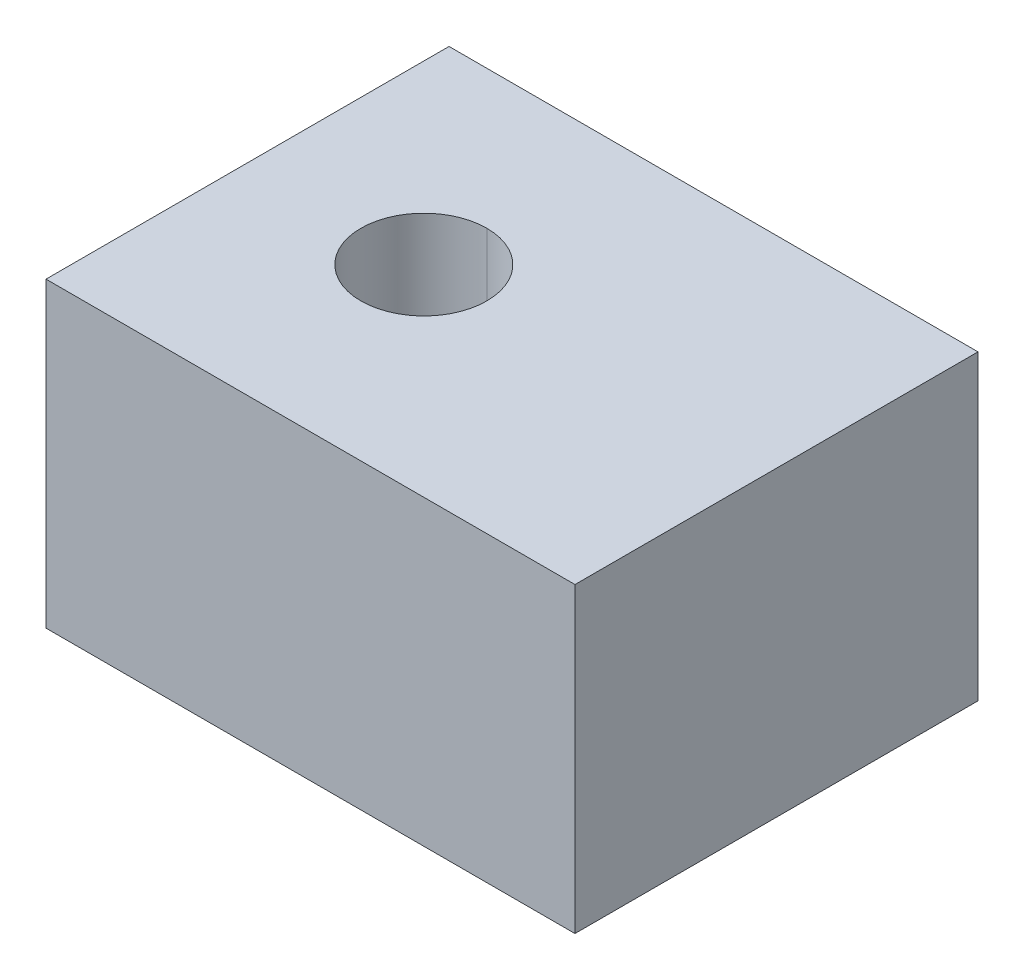
ISO-10303-21;
HEADER;
FILE_DESCRIPTION(('STEP AP214'),'2;1');
FILE_NAME('part.step','',(''),(''),'','','');
FILE_SCHEMA(('AUTOMOTIVE_DESIGN { 1 0 10303 214 1 1 1 1 }'));
ENDSEC;
DATA;
#1=APPLICATION_CONTEXT('core data for automotive mechanical design processes');
#2=APPLICATION_PROTOCOL_DEFINITION('international standard','automotive_design',2000,#1);
#3=PRODUCT_CONTEXT('',#1,'mechanical');
#4=PRODUCT('Part','Part','',(#3));
#5=PRODUCT_RELATED_PRODUCT_CATEGORY('part','',(#4));
#6=PRODUCT_DEFINITION_FORMATION('','',#4);
#7=PRODUCT_DEFINITION_CONTEXT('part definition',#1,'design');
#8=PRODUCT_DEFINITION('design','',#6,#7);
#9=PRODUCT_DEFINITION_SHAPE('','',#8);
#10=(LENGTH_UNIT() NAMED_UNIT(*) SI_UNIT(.MILLI.,.METRE.));
#11=(NAMED_UNIT(*) PLANE_ANGLE_UNIT() SI_UNIT($,.RADIAN.));
#12=(NAMED_UNIT(*) SI_UNIT($,.STERADIAN.) SOLID_ANGLE_UNIT());
#13=UNCERTAINTY_MEASURE_WITH_UNIT(LENGTH_MEASURE(1.E-05),#10,'distance_accuracy_value','');
#14=(GEOMETRIC_REPRESENTATION_CONTEXT(3) GLOBAL_UNCERTAINTY_ASSIGNED_CONTEXT((#13)) GLOBAL_UNIT_ASSIGNED_CONTEXT((#10,
#11,#12)) REPRESENTATION_CONTEXT('',''));
#15=CARTESIAN_POINT('',(0.,0.,0.));
#16=DIRECTION('',(0.,0.,1.));
#17=DIRECTION('',(1.,0.,0.));
#18=AXIS2_PLACEMENT_3D('',#15,#16,#17);
#19=CARTESIAN_POINT('',(7.,-4.99999999982492,0.));
#20=DIRECTION('',(0.,-1.,0.));
#21=DIRECTION('',(1.,0.,0.));
#22=AXIS2_PLACEMENT_3D('',#19,#20,#21);
#23=CONICAL_SURFACE('',#22,0.399999999790904,0.785398163255335);
#24=CARTESIAN_POINT('',(7.,-4.80000000000001,0.));
#25=DIRECTION('',(0.,-1.,0.));
#26=DIRECTION('',(1.,0.,0.));
#27=AXIS2_PLACEMENT_3D('',#24,#25,#26);
#28=CIRCLE('',#27,0.2);
#29=CARTESIAN_POINT('',(6.80000000004223,-4.79999999996879,0.));
#30=VERTEX_POINT('',#29);
#31=CARTESIAN_POINT('',(7.1999999999887,-4.799999999983,0.));
#32=VERTEX_POINT('',#31);
#33=EDGE_CURVE('E107',#30,#32,#28,.F.);
#34=ORIENTED_EDGE('',*,*,#33,.T.);
#35=DIRECTION('',(-0.707106781186555,0.70710678118654,0.));
#36=VECTOR('',#35,1.);
#37=CARTESIAN_POINT('',(499000.,-498997.599999989,0.));
#38=LINE('',#37,#36);
#39=CARTESIAN_POINT('',(7.39999999993052,-4.99999999993861,0.));
#40=VERTEX_POINT('',#39);
#41=EDGE_CURVE('E105',#32,#40,#38,.F.);
#42=ORIENTED_EDGE('',*,*,#41,.T.);
#43=CARTESIAN_POINT('',(7.,-4.99999999993861,0.));
#44=DIRECTION('',(0.,-1.,0.));
#45=DIRECTION('',(1.,0.,0.));
#46=AXIS2_PLACEMENT_3D('',#43,#44,#45);
#47=CIRCLE('',#46,0.399999999904591);
#48=CARTESIAN_POINT('',(6.60000000009791,-4.99999999991019,0.));
#49=VERTEX_POINT('',#48);
#50=EDGE_CURVE('E20',#49,#40,#47,.F.);
#51=ORIENTED_EDGE('',*,*,#50,.F.);
#52=DIRECTION('',(0.707106781186549,0.707106781186546,0.));
#53=VECTOR('',#52,1.);
#54=CARTESIAN_POINT('',(-498985.999999996,-498997.599999994,6.11090180246933E-11));
#55=LINE('',#54,#53);
#56=EDGE_CURVE('E119',#49,#30,#55,.T.);
#57=ORIENTED_EDGE('',*,*,#56,.T.);
#58=EDGE_LOOP('',(#34,#42,#51,#57));
#59=FACE_BOUND('',#58,.T.);
#60=ADVANCED_FACE('F17',(#59),#23,.F.);
#61=CARTESIAN_POINT('',(6.25,-5.,0.));
#62=DIRECTION('',(0.,-1.,0.));
#63=DIRECTION('',(1.,0.,0.));
#64=AXIS2_PLACEMENT_3D('',#61,#62,#63);
#65=PLANE('',#64);
#66=CARTESIAN_POINT('',(7.,-4.99999999999545,0.));
#67=DIRECTION('',(0.,1.,0.));
#68=DIRECTION('',(-1.,0.,0.));
#69=AXIS2_PLACEMENT_3D('',#66,#67,#68);
#70=CIRCLE('',#69,0.749999999920421);
#71=CARTESIAN_POINT('',(6.2500000001055,-5.0000000000523,0.));
#72=VERTEX_POINT('',#71);
#73=CARTESIAN_POINT('',(7.74999999997977,-4.99999999996703,0.));
#74=VERTEX_POINT('',#73);
#75=EDGE_CURVE('E127',#72,#74,#70,.T.);
#76=ORIENTED_EDGE('',*,*,#75,.F.);
#77=CARTESIAN_POINT('',(7.,-4.99999999999545,0.));
#78=DIRECTION('',(0.,1.,0.));
#79=DIRECTION('',(-1.,0.,0.));
#80=AXIS2_PLACEMENT_3D('',#77,#78,#79);
#81=CIRCLE('',#80,0.749999999920421);
#82=EDGE_CURVE('E124',#74,#72,#81,.T.);
#83=ORIENTED_EDGE('',*,*,#82,.F.);
#84=EDGE_LOOP('',(#76,#83));
#85=FACE_BOUND('',#84,.T.);
#86=CARTESIAN_POINT('',(7.,-4.99999999993861,0.));
#87=DIRECTION('',(0.,-1.,0.));
#88=DIRECTION('',(1.,0.,0.));
#89=AXIS2_PLACEMENT_3D('',#86,#87,#88);
#90=CIRCLE('',#89,0.399999999904591);
#91=EDGE_CURVE('E113',#40,#49,#90,.F.);
#92=ORIENTED_EDGE('',*,*,#91,.T.);
#93=ORIENTED_EDGE('',*,*,#50,.T.);
#94=EDGE_LOOP('',(#92,#93));
#95=FACE_BOUND('',#94,.T.);
#96=ADVANCED_FACE('F116',(#85,#95),#65,.T.);
#97=CARTESIAN_POINT('',(7.,-4.99999999982492,0.));
#98=DIRECTION('',(0.,-1.,0.));
#99=DIRECTION('',(1.,0.,0.));
#100=AXIS2_PLACEMENT_3D('',#97,#98,#99);
#101=CONICAL_SURFACE('',#100,0.399999999790904,0.785398163255335);
#102=ORIENTED_EDGE('',*,*,#56,.F.);
#103=ORIENTED_EDGE('',*,*,#91,.F.);
#104=ORIENTED_EDGE('',*,*,#41,.F.);
#105=CARTESIAN_POINT('',(7.,-4.80000000000001,0.));
#106=DIRECTION('',(0.,-1.,0.));
#107=DIRECTION('',(1.,0.,0.));
#108=AXIS2_PLACEMENT_3D('',#105,#106,#107);
#109=CIRCLE('',#108,0.2);
#110=EDGE_CURVE('E163',#32,#30,#109,.F.);
#111=ORIENTED_EDGE('',*,*,#110,.T.);
#112=EDGE_LOOP('',(#102,#103,#104,#111));
#113=FACE_BOUND('',#112,.T.);
#114=ADVANCED_FACE('F118',(#113),#101,.F.);
#115=CARTESIAN_POINT('',(7.,12.,0.));
#116=DIRECTION('',(0.,-1.,0.));
#117=DIRECTION('',(1.,0.,0.));
#118=AXIS2_PLACEMENT_3D('',#115,#116,#117);
#119=CYLINDRICAL_SURFACE('',#118,0.2);
#120=CARTESIAN_POINT('',(7.,4.,0.));
#121=DIRECTION('',(0.,-1.,0.));
#122=DIRECTION('',(1.,0.,0.));
#123=AXIS2_PLACEMENT_3D('',#120,#121,#122);
#124=CIRCLE('',#123,0.2);
#125=CARTESIAN_POINT('',(7.2,4.,0.));
#126=VERTEX_POINT('',#125);
#127=CARTESIAN_POINT('',(6.8,4.,0.));
#128=VERTEX_POINT('',#127);
#129=EDGE_CURVE('E122',#126,#128,#124,.T.);
#130=ORIENTED_EDGE('',*,*,#129,.F.);
#131=DIRECTION('',(0.,-1.,0.));
#132=VECTOR('',#131,1.);
#133=CARTESIAN_POINT('',(7.2,12.,0.));
#134=LINE('',#133,#132);
#135=EDGE_CURVE('E166',#126,#32,#134,.T.);
#136=ORIENTED_EDGE('',*,*,#135,.T.);
#137=ORIENTED_EDGE('',*,*,#33,.F.);
#138=DIRECTION('',(0.,-1.,0.));
#139=VECTOR('',#138,1.);
#140=CARTESIAN_POINT('',(6.8,12.,0.));
#141=LINE('',#140,#139);
#142=EDGE_CURVE('E165',#30,#128,#141,.F.);
#143=ORIENTED_EDGE('',*,*,#142,.T.);
#144=EDGE_LOOP('',(#130,#136,#137,#143));
#145=FACE_BOUND('',#144,.T.);
#146=ADVANCED_FACE('F353',(#145),#119,.F.);
#147=CARTESIAN_POINT('',(7.,-0.999999999862666,0.));
#148=DIRECTION('',(0.,1.,0.));
#149=DIRECTION('',(-1.,0.,0.));
#150=AXIS2_PLACEMENT_3D('',#147,#148,#149);
#151=CONICAL_SURFACE('',#150,3.70000000003256,0.635452992826304);
#152=DIRECTION('',(0.593542145183898,-0.804802908723929,0.));
#153=VECTOR('',#152,1.);
#154=CARTESIAN_POINT('',(-368009.9375,499000.,0.));
#155=LINE('',#154,#153);
#156=CARTESIAN_POINT('',(3.29999999999186,-0.999999999965668,0.));
#157=VERTEX_POINT('',#156);
#158=EDGE_CURVE('E174',#157,#72,#155,.T.);
#159=ORIENTED_EDGE('',*,*,#158,.F.);
#160=CARTESIAN_POINT('',(7.,-1.,0.));
#161=DIRECTION('',(0.,1.,0.));
#162=DIRECTION('',(-1.,0.,0.));
#163=AXIS2_PLACEMENT_3D('',#160,#161,#162);
#164=CIRCLE('',#163,3.7);
#165=CARTESIAN_POINT('',(10.7000000000249,-0.999999999979878,0.));
#166=VERTEX_POINT('',#165);
#167=EDGE_CURVE('E185',#166,#157,#164,.T.);
#168=ORIENTED_EDGE('',*,*,#167,.F.);
#169=DIRECTION('',(-0.593542145183897,-0.804802908723929,0.));
#170=VECTOR('',#169,1.);
#171=CARTESIAN_POINT('',(368023.9375,499000.,2.08501427439953E-10));
#172=LINE('',#171,#170);
#173=EDGE_CURVE('E130',#74,#166,#172,.F.);
#174=ORIENTED_EDGE('',*,*,#173,.F.);
#175=ORIENTED_EDGE('',*,*,#82,.T.);
#176=EDGE_LOOP('',(#159,#168,#174,#175));
#177=FACE_BOUND('',#176,.T.);
#178=ADVANCED_FACE('F345',(#177),#151,.T.);
#179=CARTESIAN_POINT('',(7.,-0.999999999862666,0.));
#180=DIRECTION('',(0.,1.,0.));
#181=DIRECTION('',(-1.,0.,0.));
#182=AXIS2_PLACEMENT_3D('',#179,#180,#181);
#183=CONICAL_SURFACE('',#182,3.70000000003256,0.635452992826304);
#184=CARTESIAN_POINT('',(7.,-1.,0.));
#185=DIRECTION('',(0.,1.,0.));
#186=DIRECTION('',(-1.,0.,0.));
#187=AXIS2_PLACEMENT_3D('',#184,#185,#186);
#188=CIRCLE('',#187,3.7);
#189=EDGE_CURVE('E181',#157,#166,#188,.T.);
#190=ORIENTED_EDGE('',*,*,#189,.F.);
#191=ORIENTED_EDGE('',*,*,#158,.T.);
#192=ORIENTED_EDGE('',*,*,#75,.T.);
#193=ORIENTED_EDGE('',*,*,#173,.T.);
#194=EDGE_LOOP('',(#190,#191,#192,#193));
#195=FACE_BOUND('',#194,.T.);
#196=ADVANCED_FACE('F337',(#195),#183,.T.);
#197=CARTESIAN_POINT('',(7.,12.,0.));
#198=DIRECTION('',(0.,-1.,0.));
#199=DIRECTION('',(1.,0.,0.));
#200=AXIS2_PLACEMENT_3D('',#197,#198,#199);
#201=CYLINDRICAL_SURFACE('',#200,0.2);
#202=ORIENTED_EDGE('',*,*,#142,.F.);
#203=ORIENTED_EDGE('',*,*,#110,.F.);
#204=ORIENTED_EDGE('',*,*,#135,.F.);
#205=CARTESIAN_POINT('',(7.,4.,0.));
#206=DIRECTION('',(0.,-1.,0.));
#207=DIRECTION('',(1.,0.,0.));
#208=AXIS2_PLACEMENT_3D('',#205,#206,#207);
#209=CIRCLE('',#208,0.2);
#210=EDGE_CURVE('E131',#128,#126,#209,.T.);
#211=ORIENTED_EDGE('',*,*,#210,.F.);
#212=EDGE_LOOP('',(#202,#203,#204,#211));
#213=FACE_BOUND('',#212,.T.);
#214=ADVANCED_FACE('F329',(#213),#201,.F.);
#215=CARTESIAN_POINT('',(7.,12.,0.));
#216=DIRECTION('',(0.,1.,0.));
#217=DIRECTION('',(-1.,0.,0.));
#218=AXIS2_PLACEMENT_3D('',#215,#216,#217);
#219=CYLINDRICAL_SURFACE('',#218,3.7);
#220=DIRECTION('',(0.,1.,0.));
#221=VECTOR('',#220,1.);
#222=CARTESIAN_POINT('',(3.3,12.,0.));
#223=LINE('',#222,#221);
#224=CARTESIAN_POINT('',(3.3,0.,0.));
#225=VERTEX_POINT('',#224);
#226=EDGE_CURVE('E135',#225,#157,#223,.F.);
#227=ORIENTED_EDGE('',*,*,#226,.F.);
#228=CARTESIAN_POINT('',(7.,0.,0.));
#229=DIRECTION('',(0.,1.,0.));
#230=DIRECTION('',(-1.,0.,0.));
#231=AXIS2_PLACEMENT_3D('',#228,#229,#230);
#232=CIRCLE('',#231,3.7);
#233=CARTESIAN_POINT('',(10.7,0.,0.));
#234=VERTEX_POINT('',#233);
#235=EDGE_CURVE('E134',#234,#225,#232,.T.);
#236=ORIENTED_EDGE('',*,*,#235,.F.);
#237=DIRECTION('',(0.,1.,0.));
#238=VECTOR('',#237,1.);
#239=CARTESIAN_POINT('',(10.7,12.,0.));
#240=LINE('',#239,#238);
#241=EDGE_CURVE('E184',#166,#234,#240,.T.);
#242=ORIENTED_EDGE('',*,*,#241,.F.);
#243=ORIENTED_EDGE('',*,*,#167,.T.);
#244=EDGE_LOOP('',(#227,#236,#242,#243));
#245=FACE_BOUND('',#244,.T.);
#246=ADVANCED_FACE('F321',(#245),#219,.T.);
#247=CARTESIAN_POINT('',(7.,12.,0.));
#248=DIRECTION('',(0.,1.,0.));
#249=DIRECTION('',(-1.,0.,0.));
#250=AXIS2_PLACEMENT_3D('',#247,#248,#249);
#251=CYLINDRICAL_SURFACE('',#250,3.7);
#252=CARTESIAN_POINT('',(7.,0.,0.));
#253=DIRECTION('',(0.,1.,0.));
#254=DIRECTION('',(-1.,0.,0.));
#255=AXIS2_PLACEMENT_3D('',#252,#253,#254);
#256=CIRCLE('',#255,3.7);
#257=EDGE_CURVE('E138',#225,#234,#256,.T.);
#258=ORIENTED_EDGE('',*,*,#257,.F.);
#259=ORIENTED_EDGE('',*,*,#226,.T.);
#260=ORIENTED_EDGE('',*,*,#189,.T.);
#261=ORIENTED_EDGE('',*,*,#241,.T.);
#262=EDGE_LOOP('',(#258,#259,#260,#261));
#263=FACE_BOUND('',#262,.T.);
#264=ADVANCED_FACE('F313',(#263),#251,.T.);
#265=CARTESIAN_POINT('',(7.,4.,0.));
#266=DIRECTION('',(0.,1.,0.));
#267=DIRECTION('',(0.,0.,1.));
#268=AXIS2_PLACEMENT_3D('',#265,#266,#267);
#269=PLANE('',#268);
#270=ORIENTED_EDGE('',*,*,#129,.T.);
#271=ORIENTED_EDGE('',*,*,#210,.T.);
#272=EDGE_LOOP('',(#270,#271));
#273=FACE_BOUND('',#272,.T.);
#274=CARTESIAN_POINT('',(7.,4.,0.));
#275=DIRECTION('',(0.,1.,0.));
#276=DIRECTION('',(0.,0.,1.));
#277=AXIS2_PLACEMENT_3D('',#274,#275,#276);
#278=CIRCLE('',#277,2.5);
#279=CARTESIAN_POINT('',(7.,4.,2.5));
#280=VERTEX_POINT('',#279);
#281=CARTESIAN_POINT('',(7.,4.,-2.5));
#282=VERTEX_POINT('',#281);
#283=EDGE_CURVE('E141',#280,#282,#278,.T.);
#284=ORIENTED_EDGE('',*,*,#283,.T.);
#285=CARTESIAN_POINT('',(7.,4.,0.));
#286=DIRECTION('',(0.,1.,0.));
#287=DIRECTION('',(0.,0.,1.));
#288=AXIS2_PLACEMENT_3D('',#285,#286,#287);
#289=CIRCLE('',#288,2.5);
#290=EDGE_CURVE('E144',#282,#280,#289,.T.);
#291=ORIENTED_EDGE('',*,*,#290,.T.);
#292=EDGE_LOOP('',(#284,#291));
#293=FACE_BOUND('',#292,.T.);
#294=ADVANCED_FACE('F306',(#273,#293),#269,.T.);
#295=CARTESIAN_POINT('',(0.,0.,-8.));
#296=DIRECTION('',(0.,-1.,0.));
#297=DIRECTION('',(0.,0.,-1.));
#298=AXIS2_PLACEMENT_3D('',#295,#296,#297);
#299=PLANE('',#298);
#300=DIRECTION('',(0.,0.,1.));
#301=VECTOR('',#300,1.);
#302=CARTESIAN_POINT('',(0.,0.,-8.));
#303=LINE('',#302,#301);
#304=CARTESIAN_POINT('',(0.,0.,-8.));
#305=VERTEX_POINT('',#304);
#306=CARTESIAN_POINT('',(0.,0.,8.));
#307=VERTEX_POINT('',#306);
#308=EDGE_CURVE('E147',#305,#307,#303,.T.);
#309=ORIENTED_EDGE('',*,*,#308,.F.);
#310=DIRECTION('',(-1.,0.,0.));
#311=VECTOR('',#310,1.);
#312=CARTESIAN_POINT('',(0.,0.,-8.));
#313=LINE('',#312,#311);
#314=CARTESIAN_POINT('',(21.,0.,-8.));
#315=VERTEX_POINT('',#314);
#316=EDGE_CURVE('E153',#315,#305,#313,.T.);
#317=ORIENTED_EDGE('',*,*,#316,.F.);
#318=DIRECTION('',(0.,0.,-1.));
#319=VECTOR('',#318,1.);
#320=CARTESIAN_POINT('',(21.,0.,-8.));
#321=LINE('',#320,#319);
#322=CARTESIAN_POINT('',(21.,0.,8.));
#323=VERTEX_POINT('',#322);
#324=EDGE_CURVE('E217',#323,#315,#321,.T.);
#325=ORIENTED_EDGE('',*,*,#324,.F.);
#326=DIRECTION('',(-1.,0.,0.));
#327=VECTOR('',#326,1.);
#328=CARTESIAN_POINT('',(0.,0.,8.));
#329=LINE('',#328,#327);
#330=EDGE_CURVE('E210',#323,#307,#329,.T.);
#331=ORIENTED_EDGE('',*,*,#330,.T.);
#332=EDGE_LOOP('',(#309,#317,#325,#331));
#333=FACE_BOUND('',#332,.T.);
#334=ORIENTED_EDGE('',*,*,#235,.T.);
#335=ORIENTED_EDGE('',*,*,#257,.T.);
#336=EDGE_LOOP('',(#334,#335));
#337=FACE_BOUND('',#336,.T.);
#338=ADVANCED_FACE('F242',(#333,#337),#299,.T.);
#339=CARTESIAN_POINT('',(7.,4.,0.));
#340=DIRECTION('',(0.,1.,0.));
#341=DIRECTION('',(0.,0.,1.));
#342=AXIS2_PLACEMENT_3D('',#339,#340,#341);
#343=CYLINDRICAL_SURFACE('',#342,2.5);
#344=ORIENTED_EDGE('',*,*,#283,.F.);
#345=DIRECTION('',(0.,1.,0.));
#346=VECTOR('',#345,1.);
#347=CARTESIAN_POINT('',(7.,4.,2.5));
#348=LINE('',#347,#346);
#349=CARTESIAN_POINT('',(7.,12.,2.5));
#350=VERTEX_POINT('',#349);
#351=EDGE_CURVE('E143',#280,#350,#348,.T.);
#352=ORIENTED_EDGE('',*,*,#351,.T.);
#353=CARTESIAN_POINT('',(7.,12.,0.));
#354=DIRECTION('',(0.,1.,0.));
#355=DIRECTION('',(0.,0.,1.));
#356=AXIS2_PLACEMENT_3D('',#353,#354,#355);
#357=CIRCLE('',#356,2.5);
#358=CARTESIAN_POINT('',(7.,12.,-2.5));
#359=VERTEX_POINT('',#358);
#360=EDGE_CURVE('E149',#359,#350,#357,.F.);
#361=ORIENTED_EDGE('',*,*,#360,.F.);
#362=DIRECTION('',(0.,1.,0.));
#363=VECTOR('',#362,1.);
#364=CARTESIAN_POINT('',(7.,4.,-2.5));
#365=LINE('',#364,#363);
#366=EDGE_CURVE('E148',#359,#282,#365,.F.);
#367=ORIENTED_EDGE('',*,*,#366,.T.);
#368=EDGE_LOOP('',(#344,#352,#361,#367));
#369=FACE_BOUND('',#368,.T.);
#370=ADVANCED_FACE('F258',(#369),#343,.F.);
#371=CARTESIAN_POINT('',(7.,4.,0.));
#372=DIRECTION('',(0.,1.,0.));
#373=DIRECTION('',(0.,0.,1.));
#374=AXIS2_PLACEMENT_3D('',#371,#372,#373);
#375=CYLINDRICAL_SURFACE('',#374,2.5);
#376=ORIENTED_EDGE('',*,*,#366,.F.);
#377=CARTESIAN_POINT('',(7.,12.,0.));
#378=DIRECTION('',(0.,1.,0.));
#379=DIRECTION('',(0.,0.,1.));
#380=AXIS2_PLACEMENT_3D('',#377,#378,#379);
#381=CIRCLE('',#380,2.5);
#382=EDGE_CURVE('E152',#350,#359,#381,.F.);
#383=ORIENTED_EDGE('',*,*,#382,.F.);
#384=ORIENTED_EDGE('',*,*,#351,.F.);
#385=ORIENTED_EDGE('',*,*,#290,.F.);
#386=EDGE_LOOP('',(#376,#383,#384,#385));
#387=FACE_BOUND('',#386,.T.);
#388=ADVANCED_FACE('F250',(#387),#375,.F.);
#389=CARTESIAN_POINT('',(0.,0.,-8.));
#390=DIRECTION('',(-1.,0.,0.));
#391=DIRECTION('',(0.,0.,1.));
#392=AXIS2_PLACEMENT_3D('',#389,#390,#391);
#393=PLANE('',#392);
#394=DIRECTION('',(0.,0.,1.));
#395=VECTOR('',#394,1.);
#396=CARTESIAN_POINT('',(0.,12.,-8.));
#397=LINE('',#396,#395);
#398=CARTESIAN_POINT('',(0.,12.,-8.));
#399=VERTEX_POINT('',#398);
#400=CARTESIAN_POINT('',(0.,12.,8.));
#401=VERTEX_POINT('',#400);
#402=EDGE_CURVE('E156',#399,#401,#397,.T.);
#403=ORIENTED_EDGE('',*,*,#402,.F.);
#404=DIRECTION('',(0.,1.,0.));
#405=VECTOR('',#404,1.);
#406=CARTESIAN_POINT('',(0.,12.,-8.));
#407=LINE('',#406,#405);
#408=EDGE_CURVE('E219',#305,#399,#407,.T.);
#409=ORIENTED_EDGE('',*,*,#408,.F.);
#410=ORIENTED_EDGE('',*,*,#308,.T.);
#411=DIRECTION('',(0.,1.,0.));
#412=VECTOR('',#411,1.);
#413=CARTESIAN_POINT('',(0.,12.,8.));
#414=LINE('',#413,#412);
#415=EDGE_CURVE('E212',#307,#401,#414,.T.);
#416=ORIENTED_EDGE('',*,*,#415,.T.);
#417=EDGE_LOOP('',(#403,#409,#410,#416));
#418=FACE_BOUND('',#417,.T.);
#419=ADVANCED_FACE('F248',(#418),#393,.T.);
#420=CARTESIAN_POINT('',(0.,12.,8.));
#421=DIRECTION('',(0.,0.,-1.));
#422=DIRECTION('',(-1.,0.,0.));
#423=AXIS2_PLACEMENT_3D('',#420,#421,#422);
#424=PLANE('',#423);
#425=ORIENTED_EDGE('',*,*,#330,.F.);
#426=DIRECTION('',(0.,1.,0.));
#427=VECTOR('',#426,1.);
#428=CARTESIAN_POINT('',(21.,0.,8.));
#429=LINE('',#428,#427);
#430=CARTESIAN_POINT('',(21.,12.,8.));
#431=VERTEX_POINT('',#430);
#432=EDGE_CURVE('E214',#431,#323,#429,.F.);
#433=ORIENTED_EDGE('',*,*,#432,.F.);
#434=DIRECTION('',(1.,0.,0.));
#435=VECTOR('',#434,1.);
#436=CARTESIAN_POINT('',(0.,12.,8.));
#437=LINE('',#436,#435);
#438=EDGE_CURVE('E227',#401,#431,#437,.T.);
#439=ORIENTED_EDGE('',*,*,#438,.F.);
#440=ORIENTED_EDGE('',*,*,#415,.F.);
#441=EDGE_LOOP('',(#425,#433,#439,#440));
#442=FACE_BOUND('',#441,.T.);
#443=ADVANCED_FACE('F239',(#442),#424,.F.);
#444=CARTESIAN_POINT('',(21.,0.,-8.));
#445=DIRECTION('',(1.,0.,0.));
#446=DIRECTION('',(0.,0.,-1.));
#447=AXIS2_PLACEMENT_3D('',#444,#445,#446);
#448=PLANE('',#447);
#449=ORIENTED_EDGE('',*,*,#324,.T.);
#450=DIRECTION('',(0.,1.,0.));
#451=VECTOR('',#450,1.);
#452=CARTESIAN_POINT('',(21.,12.,-8.));
#453=LINE('',#452,#451);
#454=CARTESIAN_POINT('',(21.,12.,-8.));
#455=VERTEX_POINT('',#454);
#456=EDGE_CURVE('E35',#455,#315,#453,.F.);
#457=ORIENTED_EDGE('',*,*,#456,.F.);
#458=DIRECTION('',(0.,0.,1.));
#459=VECTOR('',#458,1.);
#460=CARTESIAN_POINT('',(21.,12.,-8.));
#461=LINE('',#460,#459);
#462=EDGE_CURVE('E26',#431,#455,#461,.F.);
#463=ORIENTED_EDGE('',*,*,#462,.F.);
#464=ORIENTED_EDGE('',*,*,#432,.T.);
#465=EDGE_LOOP('',(#449,#457,#463,#464));
#466=FACE_BOUND('',#465,.T.);
#467=ADVANCED_FACE('F235',(#466),#448,.T.);
#468=CARTESIAN_POINT('',(0.,12.,-8.));
#469=DIRECTION('',(0.,0.,-1.));
#470=DIRECTION('',(-1.,0.,0.));
#471=AXIS2_PLACEMENT_3D('',#468,#469,#470);
#472=PLANE('',#471);
#473=ORIENTED_EDGE('',*,*,#456,.T.);
#474=ORIENTED_EDGE('',*,*,#316,.T.);
#475=ORIENTED_EDGE('',*,*,#408,.T.);
#476=DIRECTION('',(1.,0.,0.));
#477=VECTOR('',#476,1.);
#478=CARTESIAN_POINT('',(0.,12.,-8.));
#479=LINE('',#478,#477);
#480=EDGE_CURVE('E11',#455,#399,#479,.F.);
#481=ORIENTED_EDGE('',*,*,#480,.F.);
#482=EDGE_LOOP('',(#473,#474,#475,#481));
#483=FACE_BOUND('',#482,.T.);
#484=ADVANCED_FACE('F246',(#483),#472,.T.);
#485=CARTESIAN_POINT('',(0.,12.,-8.));
#486=DIRECTION('',(0.,1.,0.));
#487=DIRECTION('',(0.,0.,1.));
#488=AXIS2_PLACEMENT_3D('',#485,#486,#487);
#489=PLANE('',#488);
#490=ORIENTED_EDGE('',*,*,#462,.T.);
#491=ORIENTED_EDGE('',*,*,#480,.T.);
#492=ORIENTED_EDGE('',*,*,#402,.T.);
#493=ORIENTED_EDGE('',*,*,#438,.T.);
#494=EDGE_LOOP('',(#490,#491,#492,#493));
#495=FACE_BOUND('',#494,.T.);
#496=ORIENTED_EDGE('',*,*,#360,.T.);
#497=ORIENTED_EDGE('',*,*,#382,.T.);
#498=EDGE_LOOP('',(#496,#497));
#499=FACE_BOUND('',#498,.T.);
#500=ADVANCED_FACE('F232',(#495,#499),#489,.T.);
#501=CLOSED_SHELL('',(#60,#96,#114,#146,#178,#196,#214,#246,#264,#294,#338,#370,#388,#419,#443,
#467,#484,#500));
#502=MANIFOLD_SOLID_BREP('B1',#501);
#503=ADVANCED_BREP_SHAPE_REPRESENTATION('',(#18,#502),#14);
#504=SHAPE_DEFINITION_REPRESENTATION(#9,#503);
ENDSEC;
END-ISO-10303-21;
